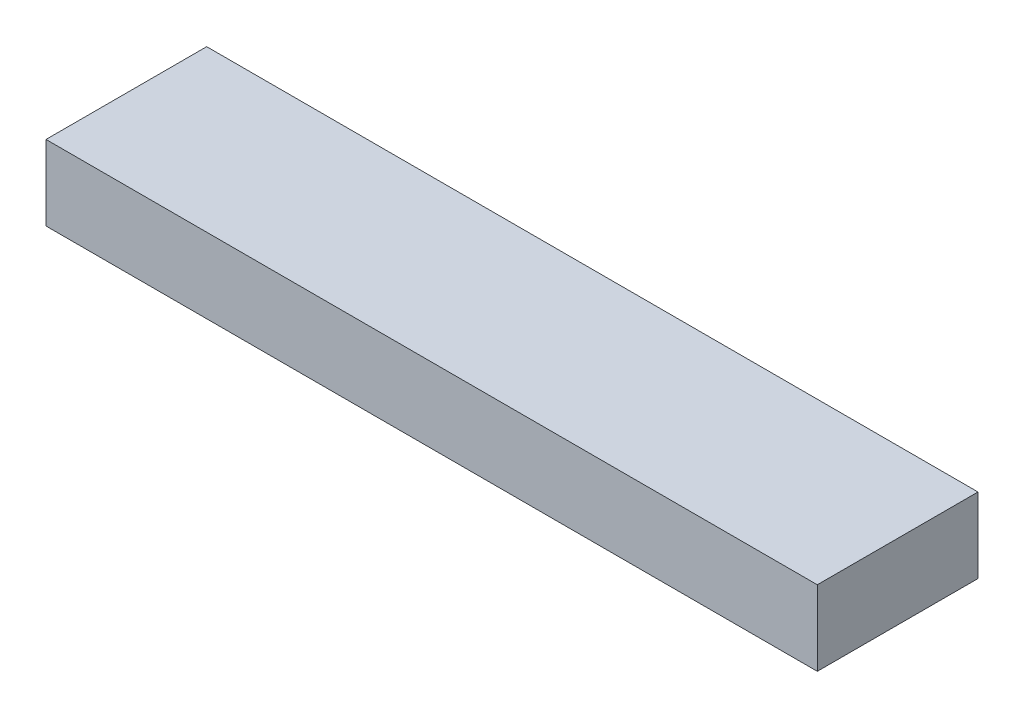
ISO-10303-21;
HEADER;
FILE_DESCRIPTION(('STEP AP214'),'2;1');
FILE_NAME('part.step','',(''),(''),'','','');
FILE_SCHEMA(('AUTOMOTIVE_DESIGN { 1 0 10303 214 1 1 1 1 }'));
ENDSEC;
DATA;
#1=APPLICATION_CONTEXT('core data for automotive mechanical design processes');
#2=APPLICATION_PROTOCOL_DEFINITION('international standard','automotive_design',2000,#1);
#3=PRODUCT_CONTEXT('',#1,'mechanical');
#4=PRODUCT('Part','Part','',(#3));
#5=PRODUCT_RELATED_PRODUCT_CATEGORY('part','',(#4));
#6=PRODUCT_DEFINITION_FORMATION('','',#4);
#7=PRODUCT_DEFINITION_CONTEXT('part definition',#1,'design');
#8=PRODUCT_DEFINITION('design','',#6,#7);
#9=PRODUCT_DEFINITION_SHAPE('','',#8);
#10=(LENGTH_UNIT() NAMED_UNIT(*) SI_UNIT(.MILLI.,.METRE.));
#11=(NAMED_UNIT(*) PLANE_ANGLE_UNIT() SI_UNIT($,.RADIAN.));
#12=(NAMED_UNIT(*) SI_UNIT($,.STERADIAN.) SOLID_ANGLE_UNIT());
#13=UNCERTAINTY_MEASURE_WITH_UNIT(LENGTH_MEASURE(1.E-05),#10,'distance_accuracy_value','');
#14=(GEOMETRIC_REPRESENTATION_CONTEXT(3) GLOBAL_UNCERTAINTY_ASSIGNED_CONTEXT((#13)) GLOBAL_UNIT_ASSIGNED_CONTEXT((#10,
#11,#12)) REPRESENTATION_CONTEXT('',''));
#15=CARTESIAN_POINT('',(0.,0.,0.));
#16=DIRECTION('',(0.,0.,1.));
#17=DIRECTION('',(1.,0.,0.));
#18=AXIS2_PLACEMENT_3D('',#15,#16,#17);
#19=CARTESIAN_POINT('',(180.,35.,37.5));
#20=DIRECTION('',(-1.,0.,0.));
#21=DIRECTION('',(0.,0.,1.));
#22=AXIS2_PLACEMENT_3D('',#19,#20,#21);
#23=PLANE('',#22);
#24=DIRECTION('',(0.,0.,-1.));
#25=VECTOR('',#24,1.);
#26=CARTESIAN_POINT('',(180.,0.,37.5));
#27=LINE('',#26,#25);
#28=CARTESIAN_POINT('',(180.,0.,37.5));
#29=VERTEX_POINT('',#28);
#30=CARTESIAN_POINT('',(180.,0.,-37.5));
#31=VERTEX_POINT('',#30);
#32=EDGE_CURVE('E97',#29,#31,#27,.T.);
#33=ORIENTED_EDGE('',*,*,#32,.T.);
#34=DIRECTION('',(0.,-1.,0.));
#35=VECTOR('',#34,1.);
#36=CARTESIAN_POINT('',(180.,35.,-37.5));
#37=LINE('',#36,#35);
#38=CARTESIAN_POINT('',(180.,35.,-37.5));
#39=VERTEX_POINT('',#38);
#40=EDGE_CURVE('E11',#39,#31,#37,.T.);
#41=ORIENTED_EDGE('',*,*,#40,.F.);
#42=DIRECTION('',(0.,0.,-1.));
#43=VECTOR('',#42,1.);
#44=CARTESIAN_POINT('',(180.,35.,37.5));
#45=LINE('',#44,#43);
#46=CARTESIAN_POINT('',(180.,35.,37.5));
#47=VERTEX_POINT('',#46);
#48=EDGE_CURVE('E85',#47,#39,#45,.T.);
#49=ORIENTED_EDGE('',*,*,#48,.F.);
#50=DIRECTION('',(0.,-1.,0.));
#51=VECTOR('',#50,1.);
#52=CARTESIAN_POINT('',(180.,35.,37.5));
#53=LINE('',#52,#51);
#54=EDGE_CURVE('E93',#47,#29,#53,.T.);
#55=ORIENTED_EDGE('',*,*,#54,.T.);
#56=EDGE_LOOP('',(#33,#41,#49,#55));
#57=FACE_BOUND('',#56,.T.);
#58=ADVANCED_FACE('F34',(#57),#23,.F.);
#59=CARTESIAN_POINT('',(-180.,35.,-37.5));
#60=DIRECTION('',(0.,0.,1.));
#61=DIRECTION('',(1.,0.,0.));
#62=AXIS2_PLACEMENT_3D('',#59,#60,#61);
#63=PLANE('',#62);
#64=DIRECTION('',(-1.,0.,0.));
#65=VECTOR('',#64,1.);
#66=CARTESIAN_POINT('',(-180.,0.,-37.5));
#67=LINE('',#66,#65);
#68=CARTESIAN_POINT('',(-180.,0.,-37.5));
#69=VERTEX_POINT('',#68);
#70=EDGE_CURVE('E89',#31,#69,#67,.T.);
#71=ORIENTED_EDGE('',*,*,#70,.T.);
#72=DIRECTION('',(0.,-1.,0.));
#73=VECTOR('',#72,1.);
#74=CARTESIAN_POINT('',(-180.,35.,-37.5));
#75=LINE('',#74,#73);
#76=CARTESIAN_POINT('',(-180.,35.,-37.5));
#77=VERTEX_POINT('',#76);
#78=EDGE_CURVE('E42',#77,#69,#75,.T.);
#79=ORIENTED_EDGE('',*,*,#78,.F.);
#80=DIRECTION('',(-1.,0.,0.));
#81=VECTOR('',#80,1.);
#82=CARTESIAN_POINT('',(-180.,35.,-37.5));
#83=LINE('',#82,#81);
#84=EDGE_CURVE('E80',#39,#77,#83,.T.);
#85=ORIENTED_EDGE('',*,*,#84,.F.);
#86=ORIENTED_EDGE('',*,*,#40,.T.);
#87=EDGE_LOOP('',(#71,#79,#85,#86));
#88=FACE_BOUND('',#87,.T.);
#89=ADVANCED_FACE('F88',(#88),#63,.F.);
#90=CARTESIAN_POINT('',(-180.,35.,37.5));
#91=DIRECTION('',(1.,0.,0.));
#92=DIRECTION('',(0.,0.,-1.));
#93=AXIS2_PLACEMENT_3D('',#90,#91,#92);
#94=PLANE('',#93);
#95=DIRECTION('',(0.,0.,1.));
#96=VECTOR('',#95,1.);
#97=CARTESIAN_POINT('',(-180.,0.,37.5));
#98=LINE('',#97,#96);
#99=CARTESIAN_POINT('',(-180.,0.,37.5));
#100=VERTEX_POINT('',#99);
#101=EDGE_CURVE('E67',#69,#100,#98,.T.);
#102=ORIENTED_EDGE('',*,*,#101,.T.);
#103=DIRECTION('',(0.,-1.,0.));
#104=VECTOR('',#103,1.);
#105=CARTESIAN_POINT('',(-180.,35.,37.5));
#106=LINE('',#105,#104);
#107=CARTESIAN_POINT('',(-180.,35.,37.5));
#108=VERTEX_POINT('',#107);
#109=EDGE_CURVE('E90',#108,#100,#106,.T.);
#110=ORIENTED_EDGE('',*,*,#109,.F.);
#111=DIRECTION('',(0.,0.,1.));
#112=VECTOR('',#111,1.);
#113=CARTESIAN_POINT('',(-180.,35.,37.5));
#114=LINE('',#113,#112);
#115=EDGE_CURVE('E83',#77,#108,#114,.T.);
#116=ORIENTED_EDGE('',*,*,#115,.F.);
#117=ORIENTED_EDGE('',*,*,#78,.T.);
#118=EDGE_LOOP('',(#102,#110,#116,#117));
#119=FACE_BOUND('',#118,.T.);
#120=ADVANCED_FACE('F91',(#119),#94,.F.);
#121=CARTESIAN_POINT('',(-180.,35.,37.5));
#122=DIRECTION('',(0.,0.,-1.));
#123=DIRECTION('',(-1.,0.,0.));
#124=AXIS2_PLACEMENT_3D('',#121,#122,#123);
#125=PLANE('',#124);
#126=DIRECTION('',(1.,0.,0.));
#127=VECTOR('',#126,1.);
#128=CARTESIAN_POINT('',(-180.,0.,37.5));
#129=LINE('',#128,#127);
#130=EDGE_CURVE('E73',#100,#29,#129,.T.);
#131=ORIENTED_EDGE('',*,*,#130,.T.);
#132=ORIENTED_EDGE('',*,*,#54,.F.);
#133=DIRECTION('',(1.,0.,0.));
#134=VECTOR('',#133,1.);
#135=CARTESIAN_POINT('',(-180.,35.,37.5));
#136=LINE('',#135,#134);
#137=EDGE_CURVE('E50',#108,#47,#136,.T.);
#138=ORIENTED_EDGE('',*,*,#137,.F.);
#139=ORIENTED_EDGE('',*,*,#109,.T.);
#140=EDGE_LOOP('',(#131,#132,#138,#139));
#141=FACE_BOUND('',#140,.T.);
#142=ADVANCED_FACE('F104',(#141),#125,.F.);
#143=CARTESIAN_POINT('',(0.,35.,0.));
#144=DIRECTION('',(0.,-1.,0.));
#145=DIRECTION('',(0.,0.,-1.));
#146=AXIS2_PLACEMENT_3D('',#143,#144,#145);
#147=PLANE('',#146);
#148=ORIENTED_EDGE('',*,*,#48,.T.);
#149=ORIENTED_EDGE('',*,*,#84,.T.);
#150=ORIENTED_EDGE('',*,*,#115,.T.);
#151=ORIENTED_EDGE('',*,*,#137,.T.);
#152=EDGE_LOOP('',(#148,#149,#150,#151));
#153=FACE_BOUND('',#152,.T.);
#154=ADVANCED_FACE('F81',(#153),#147,.F.);
#155=CARTESIAN_POINT('',(0.,0.,0.));
#156=DIRECTION('',(0.,-1.,0.));
#157=DIRECTION('',(0.,0.,-1.));
#158=AXIS2_PLACEMENT_3D('',#155,#156,#157);
#159=PLANE('',#158);
#160=ORIENTED_EDGE('',*,*,#32,.F.);
#161=ORIENTED_EDGE('',*,*,#130,.F.);
#162=ORIENTED_EDGE('',*,*,#101,.F.);
#163=ORIENTED_EDGE('',*,*,#70,.F.);
#164=EDGE_LOOP('',(#160,#161,#162,#163));
#165=FACE_BOUND('',#164,.T.);
#166=ADVANCED_FACE('F107',(#165),#159,.T.);
#167=CLOSED_SHELL('',(#58,#89,#120,#142,#154,#166));
#168=MANIFOLD_SOLID_BREP('B2',#167);
#169=ADVANCED_BREP_SHAPE_REPRESENTATION('',(#18,#168),#14);
#170=SHAPE_DEFINITION_REPRESENTATION(#9,#169);
ENDSEC;
END-ISO-10303-21;
